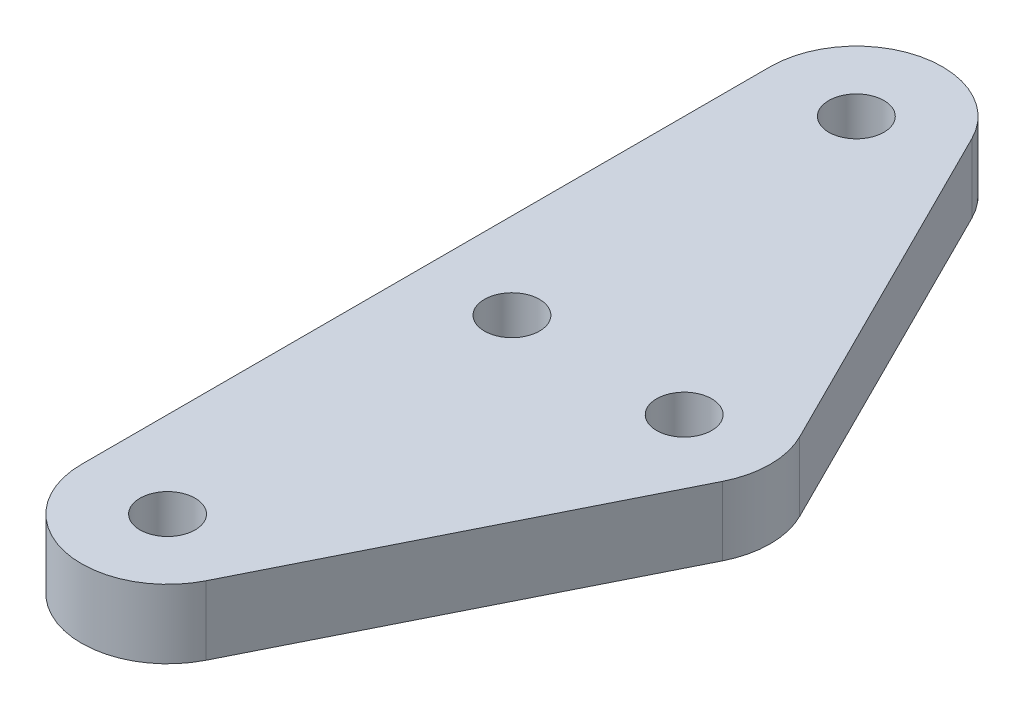
ISO-10303-21;
HEADER;
FILE_DESCRIPTION(('STEP AP214'),'2;1');
FILE_NAME('part.step','',(''),(''),'','','');
FILE_SCHEMA(('AUTOMOTIVE_DESIGN { 1 0 10303 214 1 1 1 1 }'));
ENDSEC;
DATA;
#1=APPLICATION_CONTEXT('core data for automotive mechanical design processes');
#2=APPLICATION_PROTOCOL_DEFINITION('international standard','automotive_design',2000,#1);
#3=PRODUCT_CONTEXT('',#1,'mechanical');
#4=PRODUCT('Part','Part','',(#3));
#5=PRODUCT_RELATED_PRODUCT_CATEGORY('part','',(#4));
#6=PRODUCT_DEFINITION_FORMATION('','',#4);
#7=PRODUCT_DEFINITION_CONTEXT('part definition',#1,'design');
#8=PRODUCT_DEFINITION('design','',#6,#7);
#9=PRODUCT_DEFINITION_SHAPE('','',#8);
#10=(LENGTH_UNIT() NAMED_UNIT(*) SI_UNIT(.MILLI.,.METRE.));
#11=(NAMED_UNIT(*) PLANE_ANGLE_UNIT() SI_UNIT($,.RADIAN.));
#12=(NAMED_UNIT(*) SI_UNIT($,.STERADIAN.) SOLID_ANGLE_UNIT());
#13=UNCERTAINTY_MEASURE_WITH_UNIT(LENGTH_MEASURE(1.E-05),#10,'distance_accuracy_value','');
#14=(GEOMETRIC_REPRESENTATION_CONTEXT(3) GLOBAL_UNCERTAINTY_ASSIGNED_CONTEXT((#13)) GLOBAL_UNIT_ASSIGNED_CONTEXT((#10,
#11,#12)) REPRESENTATION_CONTEXT('',''));
#15=CARTESIAN_POINT('',(0.,0.,0.));
#16=DIRECTION('',(0.,0.,1.));
#17=DIRECTION('',(1.,0.,0.));
#18=AXIS2_PLACEMENT_3D('',#15,#16,#17);
#19=CARTESIAN_POINT('',(0.,4.,-20.));
#20=DIRECTION('',(0.,1.,0.));
#21=DIRECTION('',(0.,0.,1.));
#22=AXIS2_PLACEMENT_3D('',#19,#20,#21);
#23=PLANE('',#22);
#24=CARTESIAN_POINT('',(10.,4.,0.));
#25=DIRECTION('',(0.,1.,0.));
#26=DIRECTION('',(0.,0.,1.));
#27=AXIS2_PLACEMENT_3D('',#24,#25,#26);
#28=CIRCLE('',#27,1.6);
#29=CARTESIAN_POINT('',(10.,4.,1.6));
#30=VERTEX_POINT('',#29);
#31=EDGE_CURVE('E189',#30,#30,#28,.T.);
#32=ORIENTED_EDGE('',*,*,#31,.F.);
#33=EDGE_LOOP('',(#32));
#34=FACE_BOUND('',#33,.T.);
#35=CARTESIAN_POINT('',(0.,4.,-20.));
#36=DIRECTION('',(0.,1.,0.));
#37=DIRECTION('',(0.,0.,1.));
#38=AXIS2_PLACEMENT_3D('',#35,#36,#37);
#39=CIRCLE('',#38,1.6);
#40=CARTESIAN_POINT('',(0.,4.,-18.4));
#41=VERTEX_POINT('',#40);
#42=EDGE_CURVE('E122',#41,#41,#39,.T.);
#43=ORIENTED_EDGE('',*,*,#42,.F.);
#44=EDGE_LOOP('',(#43));
#45=FACE_BOUND('',#44,.T.);
#46=CARTESIAN_POINT('',(0.,4.,-20.));
#47=DIRECTION('',(0.,1.,0.));
#48=DIRECTION('',(0.,0.,1.));
#49=AXIS2_PLACEMENT_3D('',#46,#47,#48);
#50=CIRCLE('',#49,5.);
#51=CARTESIAN_POINT('',(4.47213595499959,4.,-22.2360679774998));
#52=VERTEX_POINT('',#51);
#53=CARTESIAN_POINT('',(-4.99999999999999,4.,-20.));
#54=VERTEX_POINT('',#53);
#55=EDGE_CURVE('E129',#52,#54,#50,.T.);
#56=ORIENTED_EDGE('',*,*,#55,.T.);
#57=DIRECTION('',(0.,0.,1.));
#58=VECTOR('',#57,1.);
#59=CARTESIAN_POINT('',(-4.99999999999999,4.,-20.));
#60=LINE('',#59,#58);
#61=CARTESIAN_POINT('',(-4.99999999999999,4.,20.));
#62=VERTEX_POINT('',#61);
#63=EDGE_CURVE('E87',#54,#62,#60,.T.);
#64=ORIENTED_EDGE('',*,*,#63,.T.);
#65=CARTESIAN_POINT('',(0.,4.,20.));
#66=DIRECTION('',(0.,1.,0.));
#67=DIRECTION('',(0.,0.,1.));
#68=AXIS2_PLACEMENT_3D('',#65,#66,#67);
#69=CIRCLE('',#68,5.);
#70=CARTESIAN_POINT('',(4.47213595499959,4.,22.2360679774998));
#71=VERTEX_POINT('',#70);
#72=EDGE_CURVE('E100',#62,#71,#69,.T.);
#73=ORIENTED_EDGE('',*,*,#72,.T.);
#74=DIRECTION('',(0.447213595499958,0.,-0.894427190999916));
#75=VECTOR('',#74,1.);
#76=CARTESIAN_POINT('',(4.47213595499959,4.,22.2360679774998));
#77=LINE('',#76,#75);
#78=CARTESIAN_POINT('',(14.4721359549996,4.,2.23606797749979));
#79=VERTEX_POINT('',#78);
#80=EDGE_CURVE('E94',#71,#79,#77,.T.);
#81=ORIENTED_EDGE('',*,*,#80,.T.);
#82=CARTESIAN_POINT('',(10.,4.,0.));
#83=DIRECTION('',(0.,1.,0.));
#84=DIRECTION('',(0.,0.,1.));
#85=AXIS2_PLACEMENT_3D('',#82,#83,#84);
#86=CIRCLE('',#85,5.);
#87=CARTESIAN_POINT('',(14.4721359549996,4.,-2.23606797749979));
#88=VERTEX_POINT('',#87);
#89=EDGE_CURVE('E98',#79,#88,#86,.T.);
#90=ORIENTED_EDGE('',*,*,#89,.T.);
#91=DIRECTION('',(-0.447213595499958,0.,-0.894427190999916));
#92=VECTOR('',#91,1.);
#93=CARTESIAN_POINT('',(4.47213595499959,4.,-22.2360679774998));
#94=LINE('',#93,#92);
#95=EDGE_CURVE('E50',#88,#52,#94,.T.);
#96=ORIENTED_EDGE('',*,*,#95,.T.);
#97=EDGE_LOOP('',(#56,#64,#73,#81,#90,#96));
#98=FACE_BOUND('',#97,.T.);
#99=CARTESIAN_POINT('',(0.,4.,20.));
#100=DIRECTION('',(0.,1.,0.));
#101=DIRECTION('',(0.,0.,1.));
#102=AXIS2_PLACEMENT_3D('',#99,#100,#101);
#103=CIRCLE('',#102,1.6);
#104=CARTESIAN_POINT('',(0.,4.,21.6));
#105=VERTEX_POINT('',#104);
#106=EDGE_CURVE('E195',#105,#105,#103,.T.);
#107=ORIENTED_EDGE('',*,*,#106,.F.);
#108=EDGE_LOOP('',(#107));
#109=FACE_BOUND('',#108,.T.);
#110=CARTESIAN_POINT('',(0.,4.,0.));
#111=DIRECTION('',(0.,1.,0.));
#112=DIRECTION('',(0.,0.,1.));
#113=AXIS2_PLACEMENT_3D('',#110,#111,#112);
#114=CIRCLE('',#113,1.6);
#115=CARTESIAN_POINT('',(0.,4.,1.6));
#116=VERTEX_POINT('',#115);
#117=EDGE_CURVE('E180',#116,#116,#114,.T.);
#118=ORIENTED_EDGE('',*,*,#117,.F.);
#119=EDGE_LOOP('',(#118));
#120=FACE_BOUND('',#119,.T.);
#121=ADVANCED_FACE('F33',(#34,#45,#98,#109,#120),#23,.T.);
#122=CARTESIAN_POINT('',(0.,0.,-20.));
#123=DIRECTION('',(0.,1.,0.));
#124=DIRECTION('',(0.,0.,1.));
#125=AXIS2_PLACEMENT_3D('',#122,#123,#124);
#126=PLANE('',#125);
#127=CARTESIAN_POINT('',(0.,0.,-20.));
#128=DIRECTION('',(0.,1.,0.));
#129=DIRECTION('',(0.,0.,1.));
#130=AXIS2_PLACEMENT_3D('',#127,#128,#129);
#131=CIRCLE('',#130,5.);
#132=CARTESIAN_POINT('',(4.47213595499959,0.,-22.2360679774998));
#133=VERTEX_POINT('',#132);
#134=CARTESIAN_POINT('',(-4.99999999999999,0.,-20.));
#135=VERTEX_POINT('',#134);
#136=EDGE_CURVE('E118',#133,#135,#131,.T.);
#137=ORIENTED_EDGE('',*,*,#136,.F.);
#138=DIRECTION('',(-0.447213595499958,0.,-0.894427190999916));
#139=VECTOR('',#138,1.);
#140=CARTESIAN_POINT('',(4.47213595499959,0.,-22.2360679774998));
#141=LINE('',#140,#139);
#142=CARTESIAN_POINT('',(14.4721359549996,0.,-2.23606797749979));
#143=VERTEX_POINT('',#142);
#144=EDGE_CURVE('E79',#143,#133,#141,.T.);
#145=ORIENTED_EDGE('',*,*,#144,.F.);
#146=CARTESIAN_POINT('',(10.,0.,0.));
#147=DIRECTION('',(0.,1.,0.));
#148=DIRECTION('',(0.,0.,1.));
#149=AXIS2_PLACEMENT_3D('',#146,#147,#148);
#150=CIRCLE('',#149,5.);
#151=CARTESIAN_POINT('',(14.4721359549996,0.,2.23606797749979));
#152=VERTEX_POINT('',#151);
#153=EDGE_CURVE('E73',#152,#143,#150,.T.);
#154=ORIENTED_EDGE('',*,*,#153,.F.);
#155=DIRECTION('',(0.447213595499958,0.,-0.894427190999916));
#156=VECTOR('',#155,1.);
#157=CARTESIAN_POINT('',(4.47213595499959,0.,22.2360679774998));
#158=LINE('',#157,#156);
#159=CARTESIAN_POINT('',(4.47213595499959,0.,22.2360679774998));
#160=VERTEX_POINT('',#159);
#161=EDGE_CURVE('E108',#160,#152,#158,.T.);
#162=ORIENTED_EDGE('',*,*,#161,.F.);
#163=CARTESIAN_POINT('',(0.,0.,20.));
#164=DIRECTION('',(0.,1.,0.));
#165=DIRECTION('',(0.,0.,1.));
#166=AXIS2_PLACEMENT_3D('',#163,#164,#165);
#167=CIRCLE('',#166,5.);
#168=CARTESIAN_POINT('',(-4.99999999999999,0.,20.));
#169=VERTEX_POINT('',#168);
#170=EDGE_CURVE('E124',#169,#160,#167,.T.);
#171=ORIENTED_EDGE('',*,*,#170,.F.);
#172=DIRECTION('',(0.,0.,1.));
#173=VECTOR('',#172,1.);
#174=CARTESIAN_POINT('',(-4.99999999999999,0.,-20.));
#175=LINE('',#174,#173);
#176=EDGE_CURVE('E121',#135,#169,#175,.T.);
#177=ORIENTED_EDGE('',*,*,#176,.F.);
#178=EDGE_LOOP('',(#137,#145,#154,#162,#171,#177));
#179=FACE_BOUND('',#178,.T.);
#180=CARTESIAN_POINT('',(0.,0.,-20.));
#181=DIRECTION('',(0.,1.,0.));
#182=DIRECTION('',(0.,0.,1.));
#183=AXIS2_PLACEMENT_3D('',#180,#181,#182);
#184=CIRCLE('',#183,1.6);
#185=CARTESIAN_POINT('',(0.,0.,-18.4));
#186=VERTEX_POINT('',#185);
#187=EDGE_CURVE('E198',#186,#186,#184,.T.);
#188=ORIENTED_EDGE('',*,*,#187,.T.);
#189=EDGE_LOOP('',(#188));
#190=FACE_BOUND('',#189,.T.);
#191=CARTESIAN_POINT('',(0.,0.,20.));
#192=DIRECTION('',(0.,1.,0.));
#193=DIRECTION('',(0.,0.,1.));
#194=AXIS2_PLACEMENT_3D('',#191,#192,#193);
#195=CIRCLE('',#194,1.6);
#196=CARTESIAN_POINT('',(0.,0.,21.6));
#197=VERTEX_POINT('',#196);
#198=EDGE_CURVE('E192',#197,#197,#195,.T.);
#199=ORIENTED_EDGE('',*,*,#198,.T.);
#200=EDGE_LOOP('',(#199));
#201=FACE_BOUND('',#200,.T.);
#202=CARTESIAN_POINT('',(10.,0.,0.));
#203=DIRECTION('',(0.,1.,0.));
#204=DIRECTION('',(0.,0.,1.));
#205=AXIS2_PLACEMENT_3D('',#202,#203,#204);
#206=CIRCLE('',#205,1.6);
#207=CARTESIAN_POINT('',(10.,0.,1.6));
#208=VERTEX_POINT('',#207);
#209=EDGE_CURVE('E186',#208,#208,#206,.T.);
#210=ORIENTED_EDGE('',*,*,#209,.T.);
#211=EDGE_LOOP('',(#210));
#212=FACE_BOUND('',#211,.T.);
#213=CARTESIAN_POINT('',(0.,0.,0.));
#214=DIRECTION('',(0.,1.,0.));
#215=DIRECTION('',(0.,0.,1.));
#216=AXIS2_PLACEMENT_3D('',#213,#214,#215);
#217=CIRCLE('',#216,1.6);
#218=CARTESIAN_POINT('',(0.,0.,1.6));
#219=VERTEX_POINT('',#218);
#220=EDGE_CURVE('E183',#219,#219,#217,.T.);
#221=ORIENTED_EDGE('',*,*,#220,.T.);
#222=EDGE_LOOP('',(#221));
#223=FACE_BOUND('',#222,.T.);
#224=ADVANCED_FACE('F138',(#179,#190,#201,#212,#223),#126,.F.);
#225=CARTESIAN_POINT('',(0.,4.,-20.));
#226=DIRECTION('',(0.,-1.,0.));
#227=DIRECTION('',(0.,0.,-1.));
#228=AXIS2_PLACEMENT_3D('',#225,#226,#227);
#229=CYLINDRICAL_SURFACE('',#228,5.);
#230=ORIENTED_EDGE('',*,*,#136,.T.);
#231=DIRECTION('',(0.,-1.,0.));
#232=VECTOR('',#231,1.);
#233=CARTESIAN_POINT('',(-4.99999999999999,4.,-20.));
#234=LINE('',#233,#232);
#235=EDGE_CURVE('E11',#54,#135,#234,.T.);
#236=ORIENTED_EDGE('',*,*,#235,.F.);
#237=ORIENTED_EDGE('',*,*,#55,.F.);
#238=DIRECTION('',(0.,-1.,0.));
#239=VECTOR('',#238,1.);
#240=CARTESIAN_POINT('',(4.47213595499959,4.,-22.2360679774998));
#241=LINE('',#240,#239);
#242=EDGE_CURVE('E114',#52,#133,#241,.T.);
#243=ORIENTED_EDGE('',*,*,#242,.T.);
#244=EDGE_LOOP('',(#230,#236,#237,#243));
#245=FACE_BOUND('',#244,.T.);
#246=ADVANCED_FACE('F35',(#245),#229,.T.);
#247=CARTESIAN_POINT('',(-4.99999999999999,4.,-20.));
#248=DIRECTION('',(1.,0.,0.));
#249=DIRECTION('',(0.,0.,-1.));
#250=AXIS2_PLACEMENT_3D('',#247,#248,#249);
#251=PLANE('',#250);
#252=ORIENTED_EDGE('',*,*,#176,.T.);
#253=DIRECTION('',(0.,-1.,0.));
#254=VECTOR('',#253,1.);
#255=CARTESIAN_POINT('',(-4.99999999999999,4.,20.));
#256=LINE('',#255,#254);
#257=EDGE_CURVE('E42',#62,#169,#256,.T.);
#258=ORIENTED_EDGE('',*,*,#257,.F.);
#259=ORIENTED_EDGE('',*,*,#63,.F.);
#260=ORIENTED_EDGE('',*,*,#235,.T.);
#261=EDGE_LOOP('',(#252,#258,#259,#260));
#262=FACE_BOUND('',#261,.T.);
#263=ADVANCED_FACE('F256',(#262),#251,.F.);
#264=CARTESIAN_POINT('',(0.,4.,20.));
#265=DIRECTION('',(0.,-1.,0.));
#266=DIRECTION('',(0.,0.,-1.));
#267=AXIS2_PLACEMENT_3D('',#264,#265,#266);
#268=CYLINDRICAL_SURFACE('',#267,5.);
#269=ORIENTED_EDGE('',*,*,#170,.T.);
#270=DIRECTION('',(0.,-1.,0.));
#271=VECTOR('',#270,1.);
#272=CARTESIAN_POINT('',(4.47213595499959,4.,22.2360679774998));
#273=LINE('',#272,#271);
#274=EDGE_CURVE('E109',#71,#160,#273,.T.);
#275=ORIENTED_EDGE('',*,*,#274,.F.);
#276=ORIENTED_EDGE('',*,*,#72,.F.);
#277=ORIENTED_EDGE('',*,*,#257,.T.);
#278=EDGE_LOOP('',(#269,#275,#276,#277));
#279=FACE_BOUND('',#278,.T.);
#280=ADVANCED_FACE('F135',(#279),#268,.T.);
#281=CARTESIAN_POINT('',(4.47213595499959,4.,22.2360679774998));
#282=DIRECTION('',(-0.894427190999916,0.,-0.447213595499958));
#283=DIRECTION('',(-0.447213595499958,0.,0.894427190999916));
#284=AXIS2_PLACEMENT_3D('',#281,#282,#283);
#285=PLANE('',#284);
#286=ORIENTED_EDGE('',*,*,#161,.T.);
#287=DIRECTION('',(0.,-1.,0.));
#288=VECTOR('',#287,1.);
#289=CARTESIAN_POINT('',(14.4721359549996,4.,2.23606797749979));
#290=LINE('',#289,#288);
#291=EDGE_CURVE('E105',#79,#152,#290,.T.);
#292=ORIENTED_EDGE('',*,*,#291,.F.);
#293=ORIENTED_EDGE('',*,*,#80,.F.);
#294=ORIENTED_EDGE('',*,*,#274,.T.);
#295=EDGE_LOOP('',(#286,#292,#293,#294));
#296=FACE_BOUND('',#295,.T.);
#297=ADVANCED_FACE('F106',(#296),#285,.F.);
#298=CARTESIAN_POINT('',(10.,4.,0.));
#299=DIRECTION('',(0.,-1.,0.));
#300=DIRECTION('',(0.,0.,-1.));
#301=AXIS2_PLACEMENT_3D('',#298,#299,#300);
#302=CYLINDRICAL_SURFACE('',#301,5.);
#303=ORIENTED_EDGE('',*,*,#153,.T.);
#304=DIRECTION('',(0.,-1.,0.));
#305=VECTOR('',#304,1.);
#306=CARTESIAN_POINT('',(14.4721359549996,4.,-2.23606797749979));
#307=LINE('',#306,#305);
#308=EDGE_CURVE('E110',#88,#143,#307,.T.);
#309=ORIENTED_EDGE('',*,*,#308,.F.);
#310=ORIENTED_EDGE('',*,*,#89,.F.);
#311=ORIENTED_EDGE('',*,*,#291,.T.);
#312=EDGE_LOOP('',(#303,#309,#310,#311));
#313=FACE_BOUND('',#312,.T.);
#314=ADVANCED_FACE('F112',(#313),#302,.T.);
#315=CARTESIAN_POINT('',(4.47213595499959,4.,-22.2360679774998));
#316=DIRECTION('',(-0.894427190999916,0.,0.447213595499958));
#317=DIRECTION('',(0.447213595499958,0.,0.894427190999916));
#318=AXIS2_PLACEMENT_3D('',#315,#316,#317);
#319=PLANE('',#318);
#320=ORIENTED_EDGE('',*,*,#144,.T.);
#321=ORIENTED_EDGE('',*,*,#242,.F.);
#322=ORIENTED_EDGE('',*,*,#95,.F.);
#323=ORIENTED_EDGE('',*,*,#308,.T.);
#324=EDGE_LOOP('',(#320,#321,#322,#323));
#325=FACE_BOUND('',#324,.T.);
#326=ADVANCED_FACE('F143',(#325),#319,.F.);
#327=CARTESIAN_POINT('',(0.,4.,-20.));
#328=DIRECTION('',(0.,-1.,0.));
#329=DIRECTION('',(0.,0.,-1.));
#330=AXIS2_PLACEMENT_3D('',#327,#328,#329);
#331=CYLINDRICAL_SURFACE('',#330,1.6);
#332=ORIENTED_EDGE('',*,*,#42,.T.);
#333=EDGE_LOOP('',(#332));
#334=FACE_BOUND('',#333,.T.);
#335=ORIENTED_EDGE('',*,*,#187,.F.);
#336=EDGE_LOOP('',(#335));
#337=FACE_BOUND('',#336,.T.);
#338=ADVANCED_FACE('F145',(#334,#337),#331,.F.);
#339=CARTESIAN_POINT('',(0.,4.,20.));
#340=DIRECTION('',(0.,-1.,0.));
#341=DIRECTION('',(0.,0.,-1.));
#342=AXIS2_PLACEMENT_3D('',#339,#340,#341);
#343=CYLINDRICAL_SURFACE('',#342,1.6);
#344=ORIENTED_EDGE('',*,*,#106,.T.);
#345=EDGE_LOOP('',(#344));
#346=FACE_BOUND('',#345,.T.);
#347=ORIENTED_EDGE('',*,*,#198,.F.);
#348=EDGE_LOOP('',(#347));
#349=FACE_BOUND('',#348,.T.);
#350=ADVANCED_FACE('F151',(#346,#349),#343,.F.);
#351=CARTESIAN_POINT('',(10.,4.,0.));
#352=DIRECTION('',(0.,-1.,0.));
#353=DIRECTION('',(0.,0.,-1.));
#354=AXIS2_PLACEMENT_3D('',#351,#352,#353);
#355=CYLINDRICAL_SURFACE('',#354,1.6);
#356=ORIENTED_EDGE('',*,*,#31,.T.);
#357=EDGE_LOOP('',(#356));
#358=FACE_BOUND('',#357,.T.);
#359=ORIENTED_EDGE('',*,*,#209,.F.);
#360=EDGE_LOOP('',(#359));
#361=FACE_BOUND('',#360,.T.);
#362=ADVANCED_FACE('F167',(#358,#361),#355,.F.);
#363=CARTESIAN_POINT('',(0.,4.,0.));
#364=DIRECTION('',(0.,-1.,0.));
#365=DIRECTION('',(0.,0.,-1.));
#366=AXIS2_PLACEMENT_3D('',#363,#364,#365);
#367=CYLINDRICAL_SURFACE('',#366,1.6);
#368=ORIENTED_EDGE('',*,*,#117,.T.);
#369=EDGE_LOOP('',(#368));
#370=FACE_BOUND('',#369,.T.);
#371=ORIENTED_EDGE('',*,*,#220,.F.);
#372=EDGE_LOOP('',(#371));
#373=FACE_BOUND('',#372,.T.);
#374=ADVANCED_FACE('F171',(#370,#373),#367,.F.);
#375=CLOSED_SHELL('',(#121,#224,#246,#263,#280,#297,#314,#326,#338,#350,#362,#374));
#376=MANIFOLD_SOLID_BREP('B2',#375);
#377=ADVANCED_BREP_SHAPE_REPRESENTATION('',(#18,#376),#14);
#378=SHAPE_DEFINITION_REPRESENTATION(#9,#377);
ENDSEC;
END-ISO-10303-21;
